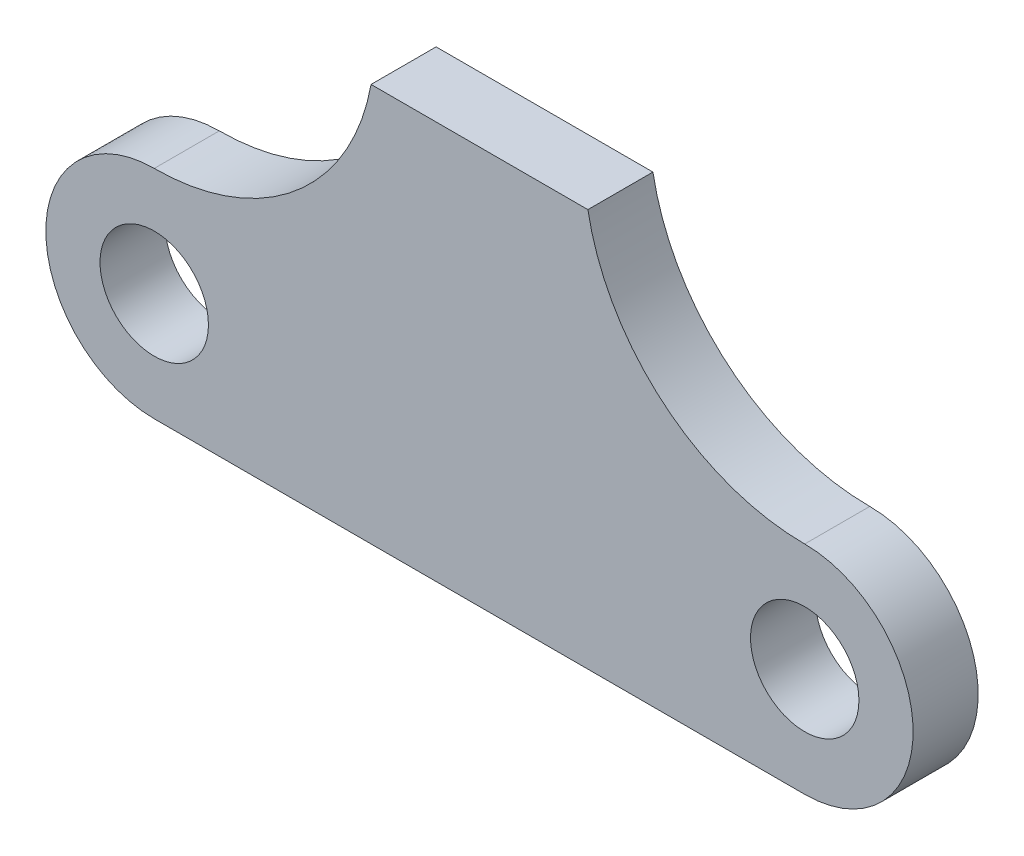
ISO-10303-21;
HEADER;
FILE_DESCRIPTION(('STEP AP214'),'2;1');
FILE_NAME('part.step','',(''),(''),'','','');
FILE_SCHEMA(('AUTOMOTIVE_DESIGN { 1 0 10303 214 1 1 1 1 }'));
ENDSEC;
DATA;
#1=APPLICATION_CONTEXT('core data for automotive mechanical design processes');
#2=APPLICATION_PROTOCOL_DEFINITION('international standard','automotive_design',2000,#1);
#3=PRODUCT_CONTEXT('',#1,'mechanical');
#4=PRODUCT('Part','Part','',(#3));
#5=PRODUCT_RELATED_PRODUCT_CATEGORY('part','',(#4));
#6=PRODUCT_DEFINITION_FORMATION('','',#4);
#7=PRODUCT_DEFINITION_CONTEXT('part definition',#1,'design');
#8=PRODUCT_DEFINITION('design','',#6,#7);
#9=PRODUCT_DEFINITION_SHAPE('','',#8);
#10=(LENGTH_UNIT() NAMED_UNIT(*) SI_UNIT(.MILLI.,.METRE.));
#11=(NAMED_UNIT(*) PLANE_ANGLE_UNIT() SI_UNIT($,.RADIAN.));
#12=(NAMED_UNIT(*) SI_UNIT($,.STERADIAN.) SOLID_ANGLE_UNIT());
#13=UNCERTAINTY_MEASURE_WITH_UNIT(LENGTH_MEASURE(1.E-05),#10,'distance_accuracy_value','');
#14=(GEOMETRIC_REPRESENTATION_CONTEXT(3) GLOBAL_UNCERTAINTY_ASSIGNED_CONTEXT((#13)) GLOBAL_UNIT_ASSIGNED_CONTEXT((#10,
#11,#12)) REPRESENTATION_CONTEXT('',''));
#15=CARTESIAN_POINT('',(0.,0.,0.));
#16=DIRECTION('',(0.,0.,1.));
#17=DIRECTION('',(1.,0.,0.));
#18=AXIS2_PLACEMENT_3D('',#15,#16,#17);
#19=CARTESIAN_POINT('',(0.,-5.,3.));
#20=DIRECTION('',(0.,1.,0.));
#21=DIRECTION('',(-1.,0.,0.));
#22=AXIS2_PLACEMENT_3D('',#19,#20,#21);
#23=PLANE('',#22);
#24=DIRECTION('',(1.,0.,0.));
#25=VECTOR('',#24,1.);
#26=CARTESIAN_POINT('',(0.,-5.,0.));
#27=LINE('',#26,#25);
#28=CARTESIAN_POINT('',(-15.,-5.,0.));
#29=VERTEX_POINT('',#28);
#30=CARTESIAN_POINT('',(15.,-4.99999999999999,0.));
#31=VERTEX_POINT('',#30);
#32=EDGE_CURVE('E124',#29,#31,#27,.T.);
#33=ORIENTED_EDGE('',*,*,#32,.T.);
#34=DIRECTION('',(0.,0.,-1.));
#35=VECTOR('',#34,1.);
#36=CARTESIAN_POINT('',(15.,-4.99999999999999,3.));
#37=LINE('',#36,#35);
#38=CARTESIAN_POINT('',(15.,-4.99999999999999,3.));
#39=VERTEX_POINT('',#38);
#40=EDGE_CURVE('E11',#39,#31,#37,.T.);
#41=ORIENTED_EDGE('',*,*,#40,.F.);
#42=DIRECTION('',(1.,0.,0.));
#43=VECTOR('',#42,1.);
#44=CARTESIAN_POINT('',(0.,-5.,3.));
#45=LINE('',#44,#43);
#46=CARTESIAN_POINT('',(-15.,-5.,3.));
#47=VERTEX_POINT('',#46);
#48=EDGE_CURVE('E149',#47,#39,#45,.T.);
#49=ORIENTED_EDGE('',*,*,#48,.F.);
#50=DIRECTION('',(0.,0.,-1.));
#51=VECTOR('',#50,1.);
#52=CARTESIAN_POINT('',(-15.,-5.,3.));
#53=LINE('',#52,#51);
#54=EDGE_CURVE('E114',#47,#29,#53,.T.);
#55=ORIENTED_EDGE('',*,*,#54,.T.);
#56=EDGE_LOOP('',(#33,#41,#49,#55));
#57=FACE_BOUND('',#56,.T.);
#58=ADVANCED_FACE('F35',(#57),#23,.F.);
#59=CARTESIAN_POINT('',(15.,0.,3.));
#60=DIRECTION('',(0.,0.,-1.));
#61=DIRECTION('',(-1.,0.,0.));
#62=AXIS2_PLACEMENT_3D('',#59,#60,#61);
#63=CYLINDRICAL_SURFACE('',#62,5.);
#64=CARTESIAN_POINT('',(15.,0.,0.));
#65=DIRECTION('',(0.,0.,1.));
#66=DIRECTION('',(1.,0.,0.));
#67=AXIS2_PLACEMENT_3D('',#64,#65,#66);
#68=CIRCLE('',#67,5.);
#69=CARTESIAN_POINT('',(15.,5.00000000000001,0.));
#70=VERTEX_POINT('',#69);
#71=EDGE_CURVE('E127',#31,#70,#68,.T.);
#72=ORIENTED_EDGE('',*,*,#71,.T.);
#73=DIRECTION('',(0.,0.,-1.));
#74=VECTOR('',#73,1.);
#75=CARTESIAN_POINT('',(15.,5.00000000000001,3.));
#76=LINE('',#75,#74);
#77=CARTESIAN_POINT('',(15.,5.00000000000001,3.));
#78=VERTEX_POINT('',#77);
#79=EDGE_CURVE('E44',#78,#70,#76,.T.);
#80=ORIENTED_EDGE('',*,*,#79,.F.);
#81=CARTESIAN_POINT('',(15.,0.,3.));
#82=DIRECTION('',(0.,0.,1.));
#83=DIRECTION('',(1.,0.,0.));
#84=AXIS2_PLACEMENT_3D('',#81,#82,#83);
#85=CIRCLE('',#84,5.);
#86=EDGE_CURVE('E85',#39,#78,#85,.T.);
#87=ORIENTED_EDGE('',*,*,#86,.F.);
#88=ORIENTED_EDGE('',*,*,#40,.T.);
#89=EDGE_LOOP('',(#72,#80,#87,#88));
#90=FACE_BOUND('',#89,.T.);
#91=ADVANCED_FACE('F164',(#90),#63,.T.);
#92=CARTESIAN_POINT('',(15.,15.1618884270382,3.));
#93=DIRECTION('',(0.,0.,-1.));
#94=DIRECTION('',(-1.,0.,0.));
#95=AXIS2_PLACEMENT_3D('',#92,#93,#94);
#96=CYLINDRICAL_SURFACE('',#95,10.1618884270382);
#97=CARTESIAN_POINT('',(15.,15.1618884270382,0.));
#98=DIRECTION('',(0.,0.,1.));
#99=DIRECTION('',(1.,0.,0.));
#100=AXIS2_PLACEMENT_3D('',#97,#98,#99);
#101=CIRCLE('',#100,10.1618884270382);
#102=CARTESIAN_POINT('',(4.99999910006002,13.3552455722459,0.));
#103=VERTEX_POINT('',#102);
#104=EDGE_CURVE('E129',#70,#103,#101,.F.);
#105=ORIENTED_EDGE('',*,*,#104,.T.);
#106=DIRECTION('',(0.,0.,-1.));
#107=VECTOR('',#106,1.);
#108=CARTESIAN_POINT('',(4.99999910006002,13.3552455722459,3.));
#109=LINE('',#108,#107);
#110=CARTESIAN_POINT('',(4.99999910006002,13.3552455722459,3.));
#111=VERTEX_POINT('',#110);
#112=EDGE_CURVE('E104',#111,#103,#109,.T.);
#113=ORIENTED_EDGE('',*,*,#112,.F.);
#114=CARTESIAN_POINT('',(15.,15.1618884270382,3.));
#115=DIRECTION('',(0.,0.,1.));
#116=DIRECTION('',(1.,0.,0.));
#117=AXIS2_PLACEMENT_3D('',#114,#115,#116);
#118=CIRCLE('',#117,10.1618884270382);
#119=EDGE_CURVE('E109',#78,#111,#118,.F.);
#120=ORIENTED_EDGE('',*,*,#119,.F.);
#121=ORIENTED_EDGE('',*,*,#79,.T.);
#122=EDGE_LOOP('',(#105,#113,#120,#121));
#123=FACE_BOUND('',#122,.T.);
#124=ADVANCED_FACE('F142',(#123),#96,.F.);
#125=CARTESIAN_POINT('',(-1.33051738317649E-05,13.3552405909778,3.));
#126=DIRECTION('',(-9.96251152581007E-07,0.999999999999504,0.));
#127=DIRECTION('',(-0.999999999999504,-9.96251152581007E-07,0.));
#128=AXIS2_PLACEMENT_3D('',#125,#126,#127);
#129=PLANE('',#128);
#130=DIRECTION('',(0.999999999999504,9.96251152581007E-07,0.));
#131=VECTOR('',#130,1.);
#132=CARTESIAN_POINT('',(-1.33051738317649E-05,13.3552405909778,0.));
#133=LINE('',#132,#131);
#134=CARTESIAN_POINT('',(-5.00000089993502,13.3552356097344,0.));
#135=VERTEX_POINT('',#134);
#136=EDGE_CURVE('E99',#135,#103,#133,.T.);
#137=ORIENTED_EDGE('',*,*,#136,.F.);
#138=DIRECTION('',(0.,0.,-1.));
#139=VECTOR('',#138,1.);
#140=CARTESIAN_POINT('',(-5.00000089993502,13.3552356097344,3.));
#141=LINE('',#140,#139);
#142=CARTESIAN_POINT('',(-5.00000089993502,13.3552356097344,3.));
#143=VERTEX_POINT('',#142);
#144=EDGE_CURVE('E94',#143,#135,#141,.T.);
#145=ORIENTED_EDGE('',*,*,#144,.F.);
#146=DIRECTION('',(0.999999999999504,9.96251152581007E-07,0.));
#147=VECTOR('',#146,1.);
#148=CARTESIAN_POINT('',(-1.33051738317649E-05,13.3552405909778,3.));
#149=LINE('',#148,#147);
#150=EDGE_CURVE('E97',#143,#111,#149,.T.);
#151=ORIENTED_EDGE('',*,*,#150,.T.);
#152=ORIENTED_EDGE('',*,*,#112,.T.);
#153=EDGE_LOOP('',(#137,#145,#151,#152));
#154=FACE_BOUND('',#153,.T.);
#155=ADVANCED_FACE('F96',(#154),#129,.T.);
#156=CARTESIAN_POINT('',(-15.,15.1618884270382,3.));
#157=DIRECTION('',(0.,0.,-1.));
#158=DIRECTION('',(-1.,0.,0.));
#159=AXIS2_PLACEMENT_3D('',#156,#157,#158);
#160=CYLINDRICAL_SURFACE('',#159,10.1618884270382);
#161=CARTESIAN_POINT('',(-15.,15.1618884270382,0.));
#162=DIRECTION('',(0.,0.,1.));
#163=DIRECTION('',(1.,0.,0.));
#164=AXIS2_PLACEMENT_3D('',#161,#162,#163);
#165=CIRCLE('',#164,10.1618884270382);
#166=CARTESIAN_POINT('',(-15.,5.,0.));
#167=VERTEX_POINT('',#166);
#168=EDGE_CURVE('E133',#167,#135,#165,.T.);
#169=ORIENTED_EDGE('',*,*,#168,.F.);
#170=DIRECTION('',(0.,0.,-1.));
#171=VECTOR('',#170,1.);
#172=CARTESIAN_POINT('',(-15.,5.,3.));
#173=LINE('',#172,#171);
#174=CARTESIAN_POINT('',(-15.,5.,3.));
#175=VERTEX_POINT('',#174);
#176=EDGE_CURVE('E74',#175,#167,#173,.T.);
#177=ORIENTED_EDGE('',*,*,#176,.F.);
#178=CARTESIAN_POINT('',(-15.,15.1618884270382,3.));
#179=DIRECTION('',(0.,0.,1.));
#180=DIRECTION('',(1.,0.,0.));
#181=AXIS2_PLACEMENT_3D('',#178,#179,#180);
#182=CIRCLE('',#181,10.1618884270382);
#183=EDGE_CURVE('E107',#175,#143,#182,.T.);
#184=ORIENTED_EDGE('',*,*,#183,.T.);
#185=ORIENTED_EDGE('',*,*,#144,.T.);
#186=EDGE_LOOP('',(#169,#177,#184,#185));
#187=FACE_BOUND('',#186,.T.);
#188=ADVANCED_FACE('F112',(#187),#160,.F.);
#189=CARTESIAN_POINT('',(-15.,0.,3.));
#190=DIRECTION('',(0.,0.,-1.));
#191=DIRECTION('',(-1.,0.,0.));
#192=AXIS2_PLACEMENT_3D('',#189,#190,#191);
#193=CYLINDRICAL_SURFACE('',#192,2.5);
#194=CARTESIAN_POINT('',(-15.,0.,3.));
#195=DIRECTION('',(0.,0.,1.));
#196=DIRECTION('',(1.,0.,0.));
#197=AXIS2_PLACEMENT_3D('',#194,#195,#196);
#198=CIRCLE('',#197,2.5);
#199=CARTESIAN_POINT('',(-12.5,0.,3.));
#200=VERTEX_POINT('',#199);
#201=EDGE_CURVE('E179',#200,#200,#198,.T.);
#202=ORIENTED_EDGE('',*,*,#201,.T.);
#203=EDGE_LOOP('',(#202));
#204=FACE_BOUND('',#203,.T.);
#205=CARTESIAN_POINT('',(-15.,0.,0.));
#206=DIRECTION('',(0.,0.,1.));
#207=DIRECTION('',(1.,0.,0.));
#208=AXIS2_PLACEMENT_3D('',#205,#206,#207);
#209=CIRCLE('',#208,2.5);
#210=CARTESIAN_POINT('',(-12.5,0.,0.));
#211=VERTEX_POINT('',#210);
#212=EDGE_CURVE('E121',#211,#211,#209,.T.);
#213=ORIENTED_EDGE('',*,*,#212,.F.);
#214=EDGE_LOOP('',(#213));
#215=FACE_BOUND('',#214,.T.);
#216=ADVANCED_FACE('F159',(#204,#215),#193,.F.);
#217=CARTESIAN_POINT('',(15.,0.,3.));
#218=DIRECTION('',(0.,0.,-1.));
#219=DIRECTION('',(-1.,0.,0.));
#220=AXIS2_PLACEMENT_3D('',#217,#218,#219);
#221=CYLINDRICAL_SURFACE('',#220,2.5);
#222=CARTESIAN_POINT('',(15.,0.,3.));
#223=DIRECTION('',(0.,0.,1.));
#224=DIRECTION('',(1.,0.,0.));
#225=AXIS2_PLACEMENT_3D('',#222,#223,#224);
#226=CIRCLE('',#225,2.5);
#227=CARTESIAN_POINT('',(17.5,0.,3.));
#228=VERTEX_POINT('',#227);
#229=EDGE_CURVE('E136',#228,#228,#226,.T.);
#230=ORIENTED_EDGE('',*,*,#229,.T.);
#231=EDGE_LOOP('',(#230));
#232=FACE_BOUND('',#231,.T.);
#233=CARTESIAN_POINT('',(15.,0.,0.));
#234=DIRECTION('',(0.,0.,1.));
#235=DIRECTION('',(1.,0.,0.));
#236=AXIS2_PLACEMENT_3D('',#233,#234,#235);
#237=CIRCLE('',#236,2.5);
#238=CARTESIAN_POINT('',(17.5,0.,0.));
#239=VERTEX_POINT('',#238);
#240=EDGE_CURVE('E118',#239,#239,#237,.T.);
#241=ORIENTED_EDGE('',*,*,#240,.F.);
#242=EDGE_LOOP('',(#241));
#243=FACE_BOUND('',#242,.T.);
#244=ADVANCED_FACE('F37',(#232,#243),#221,.F.);
#245=CARTESIAN_POINT('',(-15.,0.,3.));
#246=DIRECTION('',(0.,0.,-1.));
#247=DIRECTION('',(-1.,0.,0.));
#248=AXIS2_PLACEMENT_3D('',#245,#246,#247);
#249=CYLINDRICAL_SURFACE('',#248,5.);
#250=CARTESIAN_POINT('',(-15.,0.,0.));
#251=DIRECTION('',(0.,0.,1.));
#252=DIRECTION('',(1.,0.,0.));
#253=AXIS2_PLACEMENT_3D('',#250,#251,#252);
#254=CIRCLE('',#253,5.);
#255=EDGE_CURVE('E77',#167,#29,#254,.T.);
#256=ORIENTED_EDGE('',*,*,#255,.T.);
#257=ORIENTED_EDGE('',*,*,#54,.F.);
#258=CARTESIAN_POINT('',(-15.,0.,3.));
#259=DIRECTION('',(0.,0.,1.));
#260=DIRECTION('',(1.,0.,0.));
#261=AXIS2_PLACEMENT_3D('',#258,#259,#260);
#262=CIRCLE('',#261,5.);
#263=EDGE_CURVE('E52',#175,#47,#262,.T.);
#264=ORIENTED_EDGE('',*,*,#263,.F.);
#265=ORIENTED_EDGE('',*,*,#176,.T.);
#266=EDGE_LOOP('',(#256,#257,#264,#265));
#267=FACE_BOUND('',#266,.T.);
#268=ADVANCED_FACE('F150',(#267),#249,.T.);
#269=CARTESIAN_POINT('',(0.,0.,3.));
#270=DIRECTION('',(0.,0.,1.));
#271=DIRECTION('',(1.,0.,0.));
#272=AXIS2_PLACEMENT_3D('',#269,#270,#271);
#273=PLANE('',#272);
#274=ORIENTED_EDGE('',*,*,#229,.F.);
#275=EDGE_LOOP('',(#274));
#276=FACE_BOUND('',#275,.T.);
#277=ORIENTED_EDGE('',*,*,#201,.F.);
#278=EDGE_LOOP('',(#277));
#279=FACE_BOUND('',#278,.T.);
#280=ORIENTED_EDGE('',*,*,#48,.T.);
#281=ORIENTED_EDGE('',*,*,#86,.T.);
#282=ORIENTED_EDGE('',*,*,#119,.T.);
#283=ORIENTED_EDGE('',*,*,#150,.F.);
#284=ORIENTED_EDGE('',*,*,#183,.F.);
#285=ORIENTED_EDGE('',*,*,#263,.T.);
#286=EDGE_LOOP('',(#280,#281,#282,#283,#284,#285));
#287=FACE_BOUND('',#286,.T.);
#288=ADVANCED_FACE('F106',(#276,#279,#287),#273,.T.);
#289=CARTESIAN_POINT('',(0.,0.,0.));
#290=DIRECTION('',(0.,0.,1.));
#291=DIRECTION('',(1.,0.,0.));
#292=AXIS2_PLACEMENT_3D('',#289,#290,#291);
#293=PLANE('',#292);
#294=ORIENTED_EDGE('',*,*,#240,.T.);
#295=EDGE_LOOP('',(#294));
#296=FACE_BOUND('',#295,.T.);
#297=ORIENTED_EDGE('',*,*,#212,.T.);
#298=EDGE_LOOP('',(#297));
#299=FACE_BOUND('',#298,.T.);
#300=ORIENTED_EDGE('',*,*,#32,.F.);
#301=ORIENTED_EDGE('',*,*,#255,.F.);
#302=ORIENTED_EDGE('',*,*,#168,.T.);
#303=ORIENTED_EDGE('',*,*,#136,.T.);
#304=ORIENTED_EDGE('',*,*,#104,.F.);
#305=ORIENTED_EDGE('',*,*,#71,.F.);
#306=EDGE_LOOP('',(#300,#301,#302,#303,#304,#305));
#307=FACE_BOUND('',#306,.T.);
#308=ADVANCED_FACE('F145',(#296,#299,#307),#293,.F.);
#309=CLOSED_SHELL('',(#58,#91,#124,#155,#188,#216,#244,#268,#288,#308));
#310=MANIFOLD_SOLID_BREP('B2',#309);
#311=ADVANCED_BREP_SHAPE_REPRESENTATION('',(#18,#310),#14);
#312=SHAPE_DEFINITION_REPRESENTATION(#9,#311);
ENDSEC;
END-ISO-10303-21;
